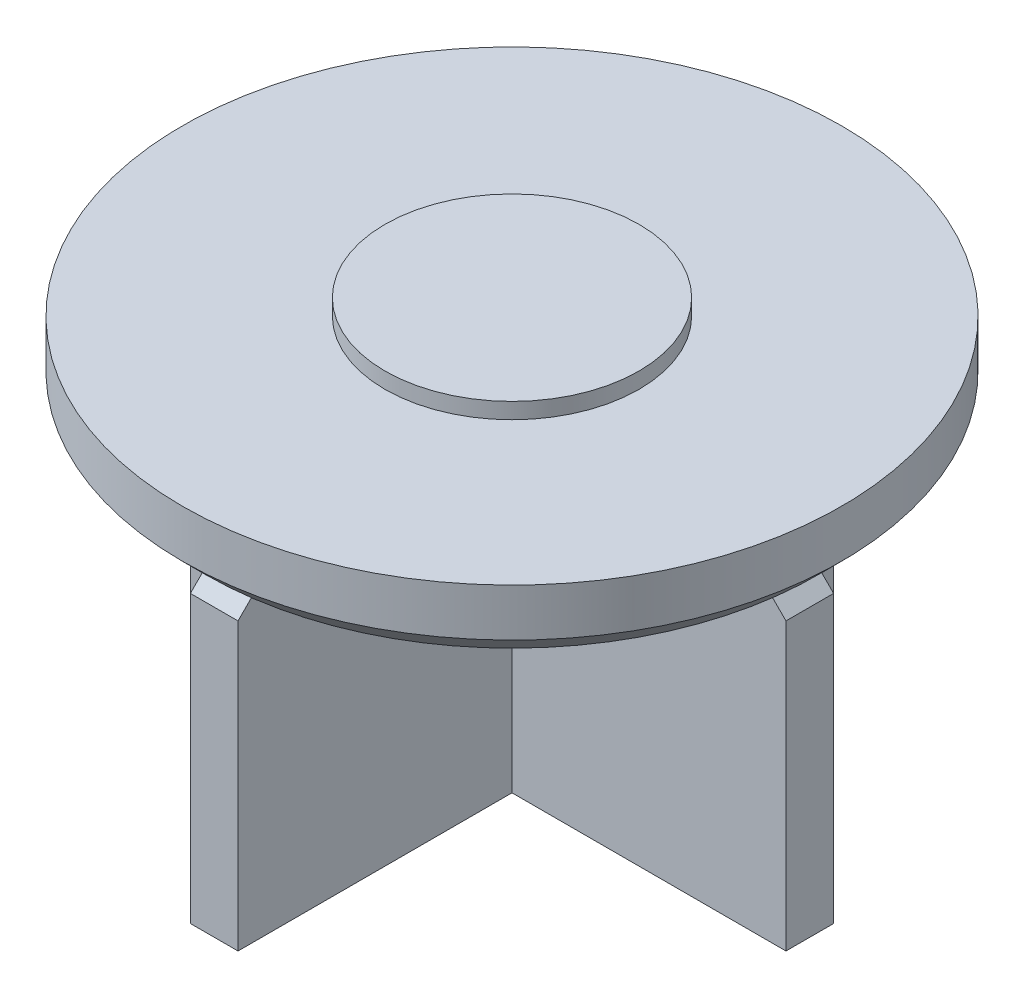
ISO-10303-21;
HEADER;
FILE_DESCRIPTION(('STEP AP214'),'2;1');
FILE_NAME('part.step','',(''),(''),'','','');
FILE_SCHEMA(('AUTOMOTIVE_DESIGN { 1 0 10303 214 1 1 1 1 }'));
ENDSEC;
DATA;
#1=APPLICATION_CONTEXT('core data for automotive mechanical design processes');
#2=APPLICATION_PROTOCOL_DEFINITION('international standard','automotive_design',2000,#1);
#3=PRODUCT_CONTEXT('',#1,'mechanical');
#4=PRODUCT('Part','Part','',(#3));
#5=PRODUCT_RELATED_PRODUCT_CATEGORY('part','',(#4));
#6=PRODUCT_DEFINITION_FORMATION('','',#4);
#7=PRODUCT_DEFINITION_CONTEXT('part definition',#1,'design');
#8=PRODUCT_DEFINITION('design','',#6,#7);
#9=PRODUCT_DEFINITION_SHAPE('','',#8);
#10=(LENGTH_UNIT() NAMED_UNIT(*) SI_UNIT(.MILLI.,.METRE.));
#11=(NAMED_UNIT(*) PLANE_ANGLE_UNIT() SI_UNIT($,.RADIAN.));
#12=(NAMED_UNIT(*) SI_UNIT($,.STERADIAN.) SOLID_ANGLE_UNIT());
#13=UNCERTAINTY_MEASURE_WITH_UNIT(LENGTH_MEASURE(1.E-05),#10,'distance_accuracy_value','');
#14=(GEOMETRIC_REPRESENTATION_CONTEXT(3) GLOBAL_UNCERTAINTY_ASSIGNED_CONTEXT((#13)) GLOBAL_UNIT_ASSIGNED_CONTEXT((#10,
#11,#12)) REPRESENTATION_CONTEXT('',''));
#15=CARTESIAN_POINT('',(0.,0.,0.));
#16=DIRECTION('',(0.,0.,1.));
#17=DIRECTION('',(1.,0.,0.));
#18=AXIS2_PLACEMENT_3D('',#15,#16,#17);
#19=CARTESIAN_POINT('',(3.00000000000002,40.,3.));
#20=DIRECTION('',(0.,0.,-1.));
#21=DIRECTION('',(-1.,0.,0.));
#22=AXIS2_PLACEMENT_3D('',#19,#20,#21);
#23=PLANE('',#22);
#24=DIRECTION('',(0.,-1.,0.));
#25=VECTOR('',#24,1.);
#26=CARTESIAN_POINT('',(37.5,40.,3.));
#27=LINE('',#26,#25);
#28=CARTESIAN_POINT('',(37.5,36.,3.));
#29=VERTEX_POINT('',#28);
#30=CARTESIAN_POINT('',(37.5,0.,3.));
#31=VERTEX_POINT('',#30);
#32=EDGE_CURVE('E287',#29,#31,#27,.T.);
#33=ORIENTED_EDGE('',*,*,#32,.F.);
#34=DIRECTION('',(0.707106781186546,-0.707106781186549,0.));
#35=VECTOR('',#34,1.);
#36=CARTESIAN_POINT('',(33.5,40.,3.));
#37=LINE('',#36,#35);
#38=CARTESIAN_POINT('',(33.5,40.,3.));
#39=VERTEX_POINT('',#38);
#40=EDGE_CURVE('E326',#29,#39,#37,.F.);
#41=ORIENTED_EDGE('',*,*,#40,.T.);
#42=DIRECTION('',(1.,0.,0.));
#43=VECTOR('',#42,1.);
#44=CARTESIAN_POINT('',(3.00000000000002,40.,3.));
#45=LINE('',#44,#43);
#46=CARTESIAN_POINT('',(3.00000000000002,40.,3.));
#47=VERTEX_POINT('',#46);
#48=EDGE_CURVE('E256',#47,#39,#45,.T.);
#49=ORIENTED_EDGE('',*,*,#48,.F.);
#50=DIRECTION('',(0.,-1.,0.));
#51=VECTOR('',#50,1.);
#52=CARTESIAN_POINT('',(3.00000000000002,40.,3.));
#53=LINE('',#52,#51);
#54=CARTESIAN_POINT('',(3.00000000000002,0.,3.));
#55=VERTEX_POINT('',#54);
#56=EDGE_CURVE('E212',#47,#55,#53,.T.);
#57=ORIENTED_EDGE('',*,*,#56,.T.);
#58=DIRECTION('',(1.,0.,0.));
#59=VECTOR('',#58,1.);
#60=CARTESIAN_POINT('',(3.00000000000002,0.,3.));
#61=LINE('',#60,#59);
#62=EDGE_CURVE('E213',#55,#31,#61,.T.);
#63=ORIENTED_EDGE('',*,*,#62,.T.);
#64=EDGE_LOOP('',(#33,#41,#49,#57,#63));
#65=FACE_BOUND('',#64,.T.);
#66=ADVANCED_FACE('F47',(#65),#23,.F.);
#67=CARTESIAN_POINT('',(37.5,40.,-3.));
#68=DIRECTION('',(-1.,0.,0.));
#69=DIRECTION('',(0.,0.,1.));
#70=AXIS2_PLACEMENT_3D('',#67,#68,#69);
#71=PLANE('',#70);
#72=DIRECTION('',(0.,-1.,0.));
#73=VECTOR('',#72,1.);
#74=CARTESIAN_POINT('',(37.5,40.,-3.));
#75=LINE('',#74,#73);
#76=CARTESIAN_POINT('',(37.5,36.,-3.));
#77=VERTEX_POINT('',#76);
#78=CARTESIAN_POINT('',(37.5,0.,-3.));
#79=VERTEX_POINT('',#78);
#80=EDGE_CURVE('E284',#77,#79,#75,.T.);
#81=ORIENTED_EDGE('',*,*,#80,.F.);
#82=DIRECTION('',(0.,0.,1.));
#83=VECTOR('',#82,1.);
#84=CARTESIAN_POINT('',(37.5,36.,-3.));
#85=LINE('',#84,#83);
#86=EDGE_CURVE('E323',#77,#29,#85,.T.);
#87=ORIENTED_EDGE('',*,*,#86,.T.);
#88=ORIENTED_EDGE('',*,*,#32,.T.);
#89=DIRECTION('',(0.,0.,-1.));
#90=VECTOR('',#89,1.);
#91=CARTESIAN_POINT('',(37.5,0.,-3.));
#92=LINE('',#91,#90);
#93=EDGE_CURVE('E217',#31,#79,#92,.T.);
#94=ORIENTED_EDGE('',*,*,#93,.T.);
#95=EDGE_LOOP('',(#81,#87,#88,#94));
#96=FACE_BOUND('',#95,.T.);
#97=ADVANCED_FACE('F405',(#96),#71,.F.);
#98=CARTESIAN_POINT('',(3.00000000000002,40.,-3.));
#99=DIRECTION('',(0.,0.,1.));
#100=DIRECTION('',(1.,0.,0.));
#101=AXIS2_PLACEMENT_3D('',#98,#99,#100);
#102=PLANE('',#101);
#103=DIRECTION('',(-1.,0.,0.));
#104=VECTOR('',#103,1.);
#105=CARTESIAN_POINT('',(3.00000000000002,40.,-3.));
#106=LINE('',#105,#104);
#107=CARTESIAN_POINT('',(33.5,40.,-3.));
#108=VERTEX_POINT('',#107);
#109=CARTESIAN_POINT('',(3.00000000000002,40.,-3.));
#110=VERTEX_POINT('',#109);
#111=EDGE_CURVE('E197',#108,#110,#106,.T.);
#112=ORIENTED_EDGE('',*,*,#111,.F.);
#113=DIRECTION('',(-0.707106781186546,0.707106781186549,0.));
#114=VECTOR('',#113,1.);
#115=CARTESIAN_POINT('',(33.5,40.,-3.));
#116=LINE('',#115,#114);
#117=EDGE_CURVE('E320',#108,#77,#116,.F.);
#118=ORIENTED_EDGE('',*,*,#117,.T.);
#119=ORIENTED_EDGE('',*,*,#80,.T.);
#120=DIRECTION('',(-1.,0.,0.));
#121=VECTOR('',#120,1.);
#122=CARTESIAN_POINT('',(3.00000000000002,0.,-3.));
#123=LINE('',#122,#121);
#124=CARTESIAN_POINT('',(3.00000000000002,0.,-3.));
#125=VERTEX_POINT('',#124);
#126=EDGE_CURVE('E222',#79,#125,#123,.T.);
#127=ORIENTED_EDGE('',*,*,#126,.T.);
#128=DIRECTION('',(0.,-1.,0.));
#129=VECTOR('',#128,1.);
#130=CARTESIAN_POINT('',(3.00000000000002,40.,-3.));
#131=LINE('',#130,#129);
#132=EDGE_CURVE('E280',#110,#125,#131,.T.);
#133=ORIENTED_EDGE('',*,*,#132,.F.);
#134=EDGE_LOOP('',(#112,#118,#119,#127,#133));
#135=FACE_BOUND('',#134,.T.);
#136=ADVANCED_FACE('F359',(#135),#102,.F.);
#137=CARTESIAN_POINT('',(3.00000000000001,40.,-37.5));
#138=DIRECTION('',(-1.,0.,0.));
#139=DIRECTION('',(0.,0.,1.));
#140=AXIS2_PLACEMENT_3D('',#137,#138,#139);
#141=PLANE('',#140);
#142=DIRECTION('',(0.,-1.,0.));
#143=VECTOR('',#142,1.);
#144=CARTESIAN_POINT('',(3.00000000000001,40.,-37.5));
#145=LINE('',#144,#143);
#146=CARTESIAN_POINT('',(3.00000000000001,36.,-37.5));
#147=VERTEX_POINT('',#146);
#148=CARTESIAN_POINT('',(3.00000000000001,0.,-37.5));
#149=VERTEX_POINT('',#148);
#150=EDGE_CURVE('E277',#147,#149,#145,.T.);
#151=ORIENTED_EDGE('',*,*,#150,.F.);
#152=DIRECTION('',(0.,-0.707106781186549,-0.707106781186546));
#153=VECTOR('',#152,1.);
#154=CARTESIAN_POINT('',(3.00000000000001,40.,-33.5));
#155=LINE('',#154,#153);
#156=CARTESIAN_POINT('',(3.00000000000001,40.,-33.5));
#157=VERTEX_POINT('',#156);
#158=EDGE_CURVE('E317',#147,#157,#155,.F.);
#159=ORIENTED_EDGE('',*,*,#158,.T.);
#160=DIRECTION('',(0.,0.,-1.));
#161=VECTOR('',#160,1.);
#162=CARTESIAN_POINT('',(3.00000000000001,40.,-37.5));
#163=LINE('',#162,#161);
#164=EDGE_CURVE('E194',#110,#157,#163,.T.);
#165=ORIENTED_EDGE('',*,*,#164,.F.);
#166=ORIENTED_EDGE('',*,*,#132,.T.);
#167=DIRECTION('',(0.,0.,-1.));
#168=VECTOR('',#167,1.);
#169=CARTESIAN_POINT('',(3.00000000000001,0.,-37.5));
#170=LINE('',#169,#168);
#171=EDGE_CURVE('E225',#125,#149,#170,.T.);
#172=ORIENTED_EDGE('',*,*,#171,.T.);
#173=EDGE_LOOP('',(#151,#159,#165,#166,#172));
#174=FACE_BOUND('',#173,.T.);
#175=ADVANCED_FACE('F365',(#174),#141,.F.);
#176=CARTESIAN_POINT('',(-2.99999999999999,40.,-37.5));
#177=DIRECTION('',(0.,0.,1.));
#178=DIRECTION('',(1.,0.,0.));
#179=AXIS2_PLACEMENT_3D('',#176,#177,#178);
#180=PLANE('',#179);
#181=DIRECTION('',(0.,-1.,0.));
#182=VECTOR('',#181,1.);
#183=CARTESIAN_POINT('',(-2.99999999999999,40.,-37.5));
#184=LINE('',#183,#182);
#185=CARTESIAN_POINT('',(-2.99999999999999,36.,-37.5));
#186=VERTEX_POINT('',#185);
#187=CARTESIAN_POINT('',(-2.99999999999999,0.,-37.5));
#188=VERTEX_POINT('',#187);
#189=EDGE_CURVE('E186',#186,#188,#184,.T.);
#190=ORIENTED_EDGE('',*,*,#189,.F.);
#191=DIRECTION('',(1.,0.,0.));
#192=VECTOR('',#191,1.);
#193=CARTESIAN_POINT('',(-2.99999999999999,36.,-37.5));
#194=LINE('',#193,#192);
#195=EDGE_CURVE('E314',#186,#147,#194,.T.);
#196=ORIENTED_EDGE('',*,*,#195,.T.);
#197=ORIENTED_EDGE('',*,*,#150,.T.);
#198=DIRECTION('',(-1.,0.,0.));
#199=VECTOR('',#198,1.);
#200=CARTESIAN_POINT('',(-2.99999999999999,0.,-37.5));
#201=LINE('',#200,#199);
#202=EDGE_CURVE('E229',#149,#188,#201,.T.);
#203=ORIENTED_EDGE('',*,*,#202,.T.);
#204=EDGE_LOOP('',(#190,#196,#197,#203));
#205=FACE_BOUND('',#204,.T.);
#206=ADVANCED_FACE('F372',(#205),#180,.F.);
#207=CARTESIAN_POINT('',(-2.99999999999999,40.,-37.5));
#208=DIRECTION('',(1.,0.,0.));
#209=DIRECTION('',(0.,0.,-1.));
#210=AXIS2_PLACEMENT_3D('',#207,#208,#209);
#211=PLANE('',#210);
#212=DIRECTION('',(0.,0.,1.));
#213=VECTOR('',#212,1.);
#214=CARTESIAN_POINT('',(-2.99999999999999,40.,-37.5));
#215=LINE('',#214,#213);
#216=CARTESIAN_POINT('',(-2.99999999999999,40.,-33.5));
#217=VERTEX_POINT('',#216);
#218=CARTESIAN_POINT('',(-2.99999999999999,40.,-3.00000000000001));
#219=VERTEX_POINT('',#218);
#220=EDGE_CURVE('E177',#217,#219,#215,.T.);
#221=ORIENTED_EDGE('',*,*,#220,.F.);
#222=DIRECTION('',(0.,0.707106781186549,0.707106781186546));
#223=VECTOR('',#222,1.);
#224=CARTESIAN_POINT('',(-2.99999999999999,40.,-33.5));
#225=LINE('',#224,#223);
#226=EDGE_CURVE('E311',#217,#186,#225,.F.);
#227=ORIENTED_EDGE('',*,*,#226,.T.);
#228=ORIENTED_EDGE('',*,*,#189,.T.);
#229=DIRECTION('',(0.,0.,1.));
#230=VECTOR('',#229,1.);
#231=CARTESIAN_POINT('',(-2.99999999999999,0.,-37.5));
#232=LINE('',#231,#230);
#233=CARTESIAN_POINT('',(-2.99999999999999,0.,-3.00000000000001));
#234=VERTEX_POINT('',#233);
#235=EDGE_CURVE('E184',#188,#234,#232,.T.);
#236=ORIENTED_EDGE('',*,*,#235,.T.);
#237=DIRECTION('',(0.,-1.,0.));
#238=VECTOR('',#237,1.);
#239=CARTESIAN_POINT('',(-2.99999999999999,40.,-3.00000000000001));
#240=LINE('',#239,#238);
#241=EDGE_CURVE('E167',#219,#234,#240,.T.);
#242=ORIENTED_EDGE('',*,*,#241,.F.);
#243=EDGE_LOOP('',(#221,#227,#228,#236,#242));
#244=FACE_BOUND('',#243,.T.);
#245=ADVANCED_FACE('F181',(#244),#211,.F.);
#246=CARTESIAN_POINT('',(-37.5,40.,-3.));
#247=DIRECTION('',(0.,0.,1.));
#248=DIRECTION('',(1.,0.,0.));
#249=AXIS2_PLACEMENT_3D('',#246,#247,#248);
#250=PLANE('',#249);
#251=DIRECTION('',(0.,-1.,0.));
#252=VECTOR('',#251,1.);
#253=CARTESIAN_POINT('',(-37.5,40.,-3.));
#254=LINE('',#253,#252);
#255=CARTESIAN_POINT('',(-37.5,36.,-3.));
#256=VERTEX_POINT('',#255);
#257=CARTESIAN_POINT('',(-37.5,0.,-3.));
#258=VERTEX_POINT('',#257);
#259=EDGE_CURVE('E187',#256,#258,#254,.T.);
#260=ORIENTED_EDGE('',*,*,#259,.F.);
#261=DIRECTION('',(-0.707106781186546,-0.707106781186549,0.));
#262=VECTOR('',#261,1.);
#263=CARTESIAN_POINT('',(-33.5,40.,-3.));
#264=LINE('',#263,#262);
#265=CARTESIAN_POINT('',(-33.5,40.,-3.));
#266=VERTEX_POINT('',#265);
#267=EDGE_CURVE('E170',#256,#266,#264,.F.);
#268=ORIENTED_EDGE('',*,*,#267,.T.);
#269=DIRECTION('',(-1.,0.,0.));
#270=VECTOR('',#269,1.);
#271=CARTESIAN_POINT('',(-37.5,40.,-3.));
#272=LINE('',#271,#270);
#273=EDGE_CURVE('E162',#219,#266,#272,.T.);
#274=ORIENTED_EDGE('',*,*,#273,.F.);
#275=ORIENTED_EDGE('',*,*,#241,.T.);
#276=DIRECTION('',(-1.,0.,0.));
#277=VECTOR('',#276,1.);
#278=CARTESIAN_POINT('',(-37.5,0.,-3.));
#279=LINE('',#278,#277);
#280=EDGE_CURVE('E235',#234,#258,#279,.T.);
#281=ORIENTED_EDGE('',*,*,#280,.T.);
#282=EDGE_LOOP('',(#260,#268,#274,#275,#281));
#283=FACE_BOUND('',#282,.T.);
#284=ADVANCED_FACE('F165',(#283),#250,.F.);
#285=CARTESIAN_POINT('',(-37.5,40.,-3.));
#286=DIRECTION('',(1.,0.,0.));
#287=DIRECTION('',(0.,0.,-1.));
#288=AXIS2_PLACEMENT_3D('',#285,#286,#287);
#289=PLANE('',#288);
#290=DIRECTION('',(0.,-1.,0.));
#291=VECTOR('',#290,1.);
#292=CARTESIAN_POINT('',(-37.5,40.,3.));
#293=LINE('',#292,#291);
#294=CARTESIAN_POINT('',(-37.5,36.,3.));
#295=VERTEX_POINT('',#294);
#296=CARTESIAN_POINT('',(-37.5,0.,3.));
#297=VERTEX_POINT('',#296);
#298=EDGE_CURVE('E270',#295,#297,#293,.T.);
#299=ORIENTED_EDGE('',*,*,#298,.F.);
#300=DIRECTION('',(0.,0.,-1.));
#301=VECTOR('',#300,1.);
#302=CARTESIAN_POINT('',(-37.5,36.,-3.));
#303=LINE('',#302,#301);
#304=EDGE_CURVE('E306',#295,#256,#303,.T.);
#305=ORIENTED_EDGE('',*,*,#304,.T.);
#306=ORIENTED_EDGE('',*,*,#259,.T.);
#307=DIRECTION('',(0.,0.,1.));
#308=VECTOR('',#307,1.);
#309=CARTESIAN_POINT('',(-37.5,0.,-3.));
#310=LINE('',#309,#308);
#311=EDGE_CURVE('E238',#258,#297,#310,.T.);
#312=ORIENTED_EDGE('',*,*,#311,.T.);
#313=EDGE_LOOP('',(#299,#305,#306,#312));
#314=FACE_BOUND('',#313,.T.);
#315=ADVANCED_FACE('F484',(#314),#289,.F.);
#316=CARTESIAN_POINT('',(-37.5,40.,3.));
#317=DIRECTION('',(0.,0.,-1.));
#318=DIRECTION('',(-1.,0.,0.));
#319=AXIS2_PLACEMENT_3D('',#316,#317,#318);
#320=PLANE('',#319);
#321=DIRECTION('',(1.,0.,0.));
#322=VECTOR('',#321,1.);
#323=CARTESIAN_POINT('',(-37.5,40.,3.));
#324=LINE('',#323,#322);
#325=CARTESIAN_POINT('',(-33.5,40.,3.));
#326=VERTEX_POINT('',#325);
#327=CARTESIAN_POINT('',(-2.99999999999999,40.,3.));
#328=VERTEX_POINT('',#327);
#329=EDGE_CURVE('E176',#326,#328,#324,.T.);
#330=ORIENTED_EDGE('',*,*,#329,.F.);
#331=DIRECTION('',(0.707106781186546,0.707106781186549,0.));
#332=VECTOR('',#331,1.);
#333=CARTESIAN_POINT('',(-33.5,40.,3.));
#334=LINE('',#333,#332);
#335=EDGE_CURVE('E303',#326,#295,#334,.F.);
#336=ORIENTED_EDGE('',*,*,#335,.T.);
#337=ORIENTED_EDGE('',*,*,#298,.T.);
#338=DIRECTION('',(1.,0.,0.));
#339=VECTOR('',#338,1.);
#340=CARTESIAN_POINT('',(-37.5,0.,3.));
#341=LINE('',#340,#339);
#342=CARTESIAN_POINT('',(-2.99999999999999,0.,3.));
#343=VERTEX_POINT('',#342);
#344=EDGE_CURVE('E242',#297,#343,#341,.T.);
#345=ORIENTED_EDGE('',*,*,#344,.T.);
#346=DIRECTION('',(0.,-1.,0.));
#347=VECTOR('',#346,1.);
#348=CARTESIAN_POINT('',(-2.99999999999999,40.,3.));
#349=LINE('',#348,#347);
#350=EDGE_CURVE('E266',#328,#343,#349,.T.);
#351=ORIENTED_EDGE('',*,*,#350,.F.);
#352=EDGE_LOOP('',(#330,#336,#337,#345,#351));
#353=FACE_BOUND('',#352,.T.);
#354=ADVANCED_FACE('F386',(#353),#320,.F.);
#355=CARTESIAN_POINT('',(-2.99999999999999,40.,3.));
#356=DIRECTION('',(1.,0.,0.));
#357=DIRECTION('',(0.,0.,-1.));
#358=AXIS2_PLACEMENT_3D('',#355,#356,#357);
#359=PLANE('',#358);
#360=DIRECTION('',(0.,-1.,0.));
#361=VECTOR('',#360,1.);
#362=CARTESIAN_POINT('',(-2.99999999999998,40.,37.5));
#363=LINE('',#362,#361);
#364=CARTESIAN_POINT('',(-2.99999999999998,36.,37.5));
#365=VERTEX_POINT('',#364);
#366=CARTESIAN_POINT('',(-2.99999999999998,0.,37.5));
#367=VERTEX_POINT('',#366);
#368=EDGE_CURVE('E263',#365,#367,#363,.T.);
#369=ORIENTED_EDGE('',*,*,#368,.F.);
#370=DIRECTION('',(0.,-0.707106781186549,0.707106781186546));
#371=VECTOR('',#370,1.);
#372=CARTESIAN_POINT('',(-2.99999999999998,40.,33.5));
#373=LINE('',#372,#371);
#374=CARTESIAN_POINT('',(-2.99999999999998,40.,33.5));
#375=VERTEX_POINT('',#374);
#376=EDGE_CURVE('E333',#365,#375,#373,.F.);
#377=ORIENTED_EDGE('',*,*,#376,.T.);
#378=DIRECTION('',(0.,0.,1.));
#379=VECTOR('',#378,1.);
#380=CARTESIAN_POINT('',(-2.99999999999999,40.,3.));
#381=LINE('',#380,#379);
#382=EDGE_CURVE('E204',#328,#375,#381,.T.);
#383=ORIENTED_EDGE('',*,*,#382,.F.);
#384=ORIENTED_EDGE('',*,*,#350,.T.);
#385=DIRECTION('',(0.,0.,1.));
#386=VECTOR('',#385,1.);
#387=CARTESIAN_POINT('',(-2.99999999999999,0.,3.));
#388=LINE('',#387,#386);
#389=EDGE_CURVE('E245',#343,#367,#388,.T.);
#390=ORIENTED_EDGE('',*,*,#389,.T.);
#391=EDGE_LOOP('',(#369,#377,#383,#384,#390));
#392=FACE_BOUND('',#391,.T.);
#393=ADVANCED_FACE('F390',(#392),#359,.F.);
#394=CARTESIAN_POINT('',(-2.99999999999998,40.,37.5));
#395=DIRECTION('',(0.,0.,-1.));
#396=DIRECTION('',(-1.,0.,0.));
#397=AXIS2_PLACEMENT_3D('',#394,#395,#396);
#398=PLANE('',#397);
#399=DIRECTION('',(0.,-1.,0.));
#400=VECTOR('',#399,1.);
#401=CARTESIAN_POINT('',(3.00000000000002,40.,37.5));
#402=LINE('',#401,#400);
#403=CARTESIAN_POINT('',(3.00000000000002,36.,37.5));
#404=VERTEX_POINT('',#403);
#405=CARTESIAN_POINT('',(3.00000000000002,0.,37.5));
#406=VERTEX_POINT('',#405);
#407=EDGE_CURVE('E260',#404,#406,#402,.T.);
#408=ORIENTED_EDGE('',*,*,#407,.F.);
#409=DIRECTION('',(-1.,0.,0.));
#410=VECTOR('',#409,1.);
#411=CARTESIAN_POINT('',(-2.99999999999998,36.,37.5));
#412=LINE('',#411,#410);
#413=EDGE_CURVE('E64',#404,#365,#412,.T.);
#414=ORIENTED_EDGE('',*,*,#413,.T.);
#415=ORIENTED_EDGE('',*,*,#368,.T.);
#416=DIRECTION('',(1.,0.,0.));
#417=VECTOR('',#416,1.);
#418=CARTESIAN_POINT('',(-2.99999999999998,0.,37.5));
#419=LINE('',#418,#417);
#420=EDGE_CURVE('E249',#367,#406,#419,.T.);
#421=ORIENTED_EDGE('',*,*,#420,.T.);
#422=EDGE_LOOP('',(#408,#414,#415,#421));
#423=FACE_BOUND('',#422,.T.);
#424=ADVANCED_FACE('F408',(#423),#398,.F.);
#425=CARTESIAN_POINT('',(3.00000000000002,40.,3.));
#426=DIRECTION('',(-1.,0.,0.));
#427=DIRECTION('',(0.,0.,1.));
#428=AXIS2_PLACEMENT_3D('',#425,#426,#427);
#429=PLANE('',#428);
#430=DIRECTION('',(0.,0.,-1.));
#431=VECTOR('',#430,1.);
#432=CARTESIAN_POINT('',(3.00000000000002,40.,3.));
#433=LINE('',#432,#431);
#434=CARTESIAN_POINT('',(3.00000000000002,40.,33.5));
#435=VERTEX_POINT('',#434);
#436=EDGE_CURVE('E208',#435,#47,#433,.T.);
#437=ORIENTED_EDGE('',*,*,#436,.F.);
#438=DIRECTION('',(0.,0.707106781186549,-0.707106781186546));
#439=VECTOR('',#438,1.);
#440=CARTESIAN_POINT('',(3.00000000000002,40.,33.5));
#441=LINE('',#440,#439);
#442=EDGE_CURVE('E72',#435,#404,#441,.F.);
#443=ORIENTED_EDGE('',*,*,#442,.T.);
#444=ORIENTED_EDGE('',*,*,#407,.T.);
#445=DIRECTION('',(0.,0.,-1.));
#446=VECTOR('',#445,1.);
#447=CARTESIAN_POINT('',(3.00000000000002,0.,3.));
#448=LINE('',#447,#446);
#449=EDGE_CURVE('E253',#406,#55,#448,.T.);
#450=ORIENTED_EDGE('',*,*,#449,.T.);
#451=ORIENTED_EDGE('',*,*,#56,.F.);
#452=EDGE_LOOP('',(#437,#443,#444,#450,#451));
#453=FACE_BOUND('',#452,.T.);
#454=ADVANCED_FACE('F396',(#453),#429,.F.);
#455=CARTESIAN_POINT('',(0.,0.,0.));
#456=DIRECTION('',(0.,-1.,0.));
#457=DIRECTION('',(0.,0.,-1.));
#458=AXIS2_PLACEMENT_3D('',#455,#456,#457);
#459=PLANE('',#458);
#460=ORIENTED_EDGE('',*,*,#62,.F.);
#461=ORIENTED_EDGE('',*,*,#449,.F.);
#462=ORIENTED_EDGE('',*,*,#420,.F.);
#463=ORIENTED_EDGE('',*,*,#389,.F.);
#464=ORIENTED_EDGE('',*,*,#344,.F.);
#465=ORIENTED_EDGE('',*,*,#311,.F.);
#466=ORIENTED_EDGE('',*,*,#280,.F.);
#467=ORIENTED_EDGE('',*,*,#235,.F.);
#468=ORIENTED_EDGE('',*,*,#202,.F.);
#469=ORIENTED_EDGE('',*,*,#171,.F.);
#470=ORIENTED_EDGE('',*,*,#126,.F.);
#471=ORIENTED_EDGE('',*,*,#93,.F.);
#472=EDGE_LOOP('',(#460,#461,#462,#463,#464,#465,#466,#467,#468,#469,#470,#471));
#473=FACE_BOUND('',#472,.T.);
#474=ADVANCED_FACE('F376',(#473),#459,.T.);
#475=CARTESIAN_POINT('',(-33.5,40.,0.));
#476=DIRECTION('',(0.707106781186549,-0.707106781186546,0.));
#477=DIRECTION('',(0.,0.,1.));
#478=AXIS2_PLACEMENT_3D('',#475,#476,#477);
#479=PLANE('',#478);
#480=ORIENTED_EDGE('',*,*,#267,.F.);
#481=ORIENTED_EDGE('',*,*,#304,.F.);
#482=ORIENTED_EDGE('',*,*,#335,.F.);
#483=DIRECTION('',(0.,0.,1.));
#484=VECTOR('',#483,1.);
#485=CARTESIAN_POINT('',(-33.5,40.,0.));
#486=LINE('',#485,#484);
#487=EDGE_CURVE('E300',#266,#326,#486,.T.);
#488=ORIENTED_EDGE('',*,*,#487,.F.);
#489=EDGE_LOOP('',(#480,#481,#482,#488));
#490=FACE_BOUND('',#489,.T.);
#491=ADVANCED_FACE('F382',(#490),#479,.F.);
#492=CARTESIAN_POINT('',(0.,40.,-33.5));
#493=DIRECTION('',(0.,-0.707106781186546,0.707106781186549));
#494=DIRECTION('',(-1.,0.,0.));
#495=AXIS2_PLACEMENT_3D('',#492,#493,#494);
#496=PLANE('',#495);
#497=ORIENTED_EDGE('',*,*,#158,.F.);
#498=ORIENTED_EDGE('',*,*,#195,.F.);
#499=ORIENTED_EDGE('',*,*,#226,.F.);
#500=DIRECTION('',(-1.,0.,0.));
#501=VECTOR('',#500,1.);
#502=CARTESIAN_POINT('',(0.,40.,-33.5));
#503=LINE('',#502,#501);
#504=EDGE_CURVE('E192',#157,#217,#503,.T.);
#505=ORIENTED_EDGE('',*,*,#504,.F.);
#506=EDGE_LOOP('',(#497,#498,#499,#505));
#507=FACE_BOUND('',#506,.T.);
#508=ADVANCED_FACE('F369',(#507),#496,.F.);
#509=CARTESIAN_POINT('',(33.5,40.,0.));
#510=DIRECTION('',(-0.707106781186549,-0.707106781186546,0.));
#511=DIRECTION('',(0.,0.,-1.));
#512=AXIS2_PLACEMENT_3D('',#509,#510,#511);
#513=PLANE('',#512);
#514=ORIENTED_EDGE('',*,*,#40,.F.);
#515=ORIENTED_EDGE('',*,*,#86,.F.);
#516=ORIENTED_EDGE('',*,*,#117,.F.);
#517=DIRECTION('',(0.,0.,-1.));
#518=VECTOR('',#517,1.);
#519=CARTESIAN_POINT('',(33.5,40.,0.));
#520=LINE('',#519,#518);
#521=EDGE_CURVE('E294',#39,#108,#520,.T.);
#522=ORIENTED_EDGE('',*,*,#521,.F.);
#523=EDGE_LOOP('',(#514,#515,#516,#522));
#524=FACE_BOUND('',#523,.T.);
#525=ADVANCED_FACE('F403',(#524),#513,.F.);
#526=CARTESIAN_POINT('',(0.,40.,33.5));
#527=DIRECTION('',(0.,-0.707106781186546,-0.707106781186549));
#528=DIRECTION('',(1.,0.,0.));
#529=AXIS2_PLACEMENT_3D('',#526,#527,#528);
#530=PLANE('',#529);
#531=ORIENTED_EDGE('',*,*,#376,.F.);
#532=ORIENTED_EDGE('',*,*,#413,.F.);
#533=ORIENTED_EDGE('',*,*,#442,.F.);
#534=DIRECTION('',(1.,0.,0.));
#535=VECTOR('',#534,1.);
#536=CARTESIAN_POINT('',(0.,40.,33.5));
#537=LINE('',#536,#535);
#538=EDGE_CURVE('E290',#375,#435,#537,.T.);
#539=ORIENTED_EDGE('',*,*,#538,.F.);
#540=EDGE_LOOP('',(#531,#532,#533,#539));
#541=FACE_BOUND('',#540,.T.);
#542=ADVANCED_FACE('F394',(#541),#530,.F.);
#543=CARTESIAN_POINT('',(0.,40.,0.));
#544=DIRECTION('',(0.,1.,0.));
#545=DIRECTION('',(0.,0.,1.));
#546=AXIS2_PLACEMENT_3D('',#543,#544,#545);
#547=PLANE('',#546);
#548=CARTESIAN_POINT('',(0.,40.,0.));
#549=DIRECTION('',(0.,1.,0.));
#550=DIRECTION('',(0.,0.,1.));
#551=AXIS2_PLACEMENT_3D('',#548,#549,#550);
#552=CIRCLE('',#551,38.5);
#553=CARTESIAN_POINT('',(0.,40.,38.5));
#554=VERTEX_POINT('',#553);
#555=EDGE_CURVE('E11',#554,#554,#552,.F.);
#556=ORIENTED_EDGE('',*,*,#555,.T.);
#557=EDGE_LOOP('',(#556));
#558=FACE_BOUND('',#557,.T.);
#559=ORIENTED_EDGE('',*,*,#220,.T.);
#560=ORIENTED_EDGE('',*,*,#273,.T.);
#561=ORIENTED_EDGE('',*,*,#487,.T.);
#562=ORIENTED_EDGE('',*,*,#329,.T.);
#563=ORIENTED_EDGE('',*,*,#382,.T.);
#564=ORIENTED_EDGE('',*,*,#538,.T.);
#565=ORIENTED_EDGE('',*,*,#436,.T.);
#566=ORIENTED_EDGE('',*,*,#48,.T.);
#567=ORIENTED_EDGE('',*,*,#521,.T.);
#568=ORIENTED_EDGE('',*,*,#111,.T.);
#569=ORIENTED_EDGE('',*,*,#164,.T.);
#570=ORIENTED_EDGE('',*,*,#504,.T.);
#571=EDGE_LOOP('',(#559,#560,#561,#562,#563,#564,#565,#566,#567,#568,#569,#570));
#572=FACE_BOUND('',#571,.T.);
#573=ADVANCED_FACE('F189',(#558,#572),#547,.F.);
#574=CARTESIAN_POINT('',(0.,49.,0.));
#575=DIRECTION('',(0.,-1.,0.));
#576=DIRECTION('',(0.,0.,-1.));
#577=AXIS2_PLACEMENT_3D('',#574,#575,#576);
#578=CYLINDRICAL_SURFACE('',#577,41.5);
#579=CARTESIAN_POINT('',(0.,43.,0.));
#580=DIRECTION('',(0.,1.,0.));
#581=DIRECTION('',(0.,0.,1.));
#582=AXIS2_PLACEMENT_3D('',#579,#580,#581);
#583=CIRCLE('',#582,41.5);
#584=CARTESIAN_POINT('',(0.,43.,41.5));
#585=VERTEX_POINT('',#584);
#586=EDGE_CURVE('E57',#585,#585,#583,.T.);
#587=ORIENTED_EDGE('',*,*,#586,.T.);
#588=EDGE_LOOP('',(#587));
#589=FACE_BOUND('',#588,.T.);
#590=CARTESIAN_POINT('',(0.,49.,0.));
#591=DIRECTION('',(0.,1.,0.));
#592=DIRECTION('',(0.,0.,1.));
#593=AXIS2_PLACEMENT_3D('',#590,#591,#592);
#594=CIRCLE('',#593,41.5);
#595=CARTESIAN_POINT('',(0.,49.,41.5));
#596=VERTEX_POINT('',#595);
#597=EDGE_CURVE('E218',#596,#596,#594,.T.);
#598=ORIENTED_EDGE('',*,*,#597,.F.);
#599=EDGE_LOOP('',(#598));
#600=FACE_BOUND('',#599,.T.);
#601=ADVANCED_FACE('F449',(#589,#600),#578,.T.);
#602=CARTESIAN_POINT('',(0.,49.,0.));
#603=DIRECTION('',(0.,1.,0.));
#604=DIRECTION('',(0.,0.,1.));
#605=AXIS2_PLACEMENT_3D('',#602,#603,#604);
#606=PLANE('',#605);
#607=CARTESIAN_POINT('',(0.,49.,0.));
#608=DIRECTION('',(0.,1.,0.));
#609=DIRECTION('',(0.,0.,1.));
#610=AXIS2_PLACEMENT_3D('',#607,#608,#609);
#611=CIRCLE('',#610,16.);
#612=CARTESIAN_POINT('',(0.,49.,16.));
#613=VERTEX_POINT('',#612);
#614=EDGE_CURVE('E335',#613,#613,#611,.T.);
#615=ORIENTED_EDGE('',*,*,#614,.F.);
#616=EDGE_LOOP('',(#615));
#617=FACE_BOUND('',#616,.T.);
#618=ORIENTED_EDGE('',*,*,#597,.T.);
#619=EDGE_LOOP('',(#618));
#620=FACE_BOUND('',#619,.T.);
#621=ADVANCED_FACE('F456',(#617,#620),#606,.T.);
#622=CARTESIAN_POINT('',(0.,51.,0.));
#623=DIRECTION('',(0.,-1.,0.));
#624=DIRECTION('',(0.,0.,-1.));
#625=AXIS2_PLACEMENT_3D('',#622,#623,#624);
#626=CYLINDRICAL_SURFACE('',#625,16.);
#627=CARTESIAN_POINT('',(0.,51.,0.));
#628=DIRECTION('',(0.,1.,0.));
#629=DIRECTION('',(0.,0.,1.));
#630=AXIS2_PLACEMENT_3D('',#627,#628,#629);
#631=CIRCLE('',#630,16.);
#632=CARTESIAN_POINT('',(0.,51.,16.));
#633=VERTEX_POINT('',#632);
#634=EDGE_CURVE('E347',#633,#633,#631,.T.);
#635=ORIENTED_EDGE('',*,*,#634,.F.);
#636=EDGE_LOOP('',(#635));
#637=FACE_BOUND('',#636,.T.);
#638=ORIENTED_EDGE('',*,*,#614,.T.);
#639=EDGE_LOOP('',(#638));
#640=FACE_BOUND('',#639,.T.);
#641=ADVANCED_FACE('F555',(#637,#640),#626,.T.);
#642=CARTESIAN_POINT('',(0.,51.,0.));
#643=DIRECTION('',(0.,1.,0.));
#644=DIRECTION('',(0.,0.,1.));
#645=AXIS2_PLACEMENT_3D('',#642,#643,#644);
#646=PLANE('',#645);
#647=ORIENTED_EDGE('',*,*,#634,.T.);
#648=EDGE_LOOP('',(#647));
#649=FACE_BOUND('',#648,.T.);
#650=ADVANCED_FACE('F564',(#649),#646,.T.);
#651=CARTESIAN_POINT('',(0.,43.,0.));
#652=DIRECTION('',(0.,1.,0.));
#653=DIRECTION('',(0.,0.,1.));
#654=AXIS2_PLACEMENT_3D('',#651,#652,#653);
#655=CONICAL_SURFACE('',#654,41.5,0.785398163397451);
#656=CARTESIAN_POINT('',(0.,40.,38.5));
#657=CARTESIAN_POINT('',(0.,40.03125,38.53125));
#658=CARTESIAN_POINT('',(0.,40.0625,38.5625));
#659=CARTESIAN_POINT('',(0.,40.125,38.625));
#660=CARTESIAN_POINT('',(0.,40.15625,38.65625));
#661=CARTESIAN_POINT('',(0.,40.21875,38.71875));
#662=CARTESIAN_POINT('',(0.,40.25,38.75));
#663=CARTESIAN_POINT('',(0.,40.3125,38.8125));
#664=CARTESIAN_POINT('',(0.,40.34375,38.84375));
#665=CARTESIAN_POINT('',(0.,40.40625,38.90625));
#666=CARTESIAN_POINT('',(0.,40.4375,38.9375));
#667=CARTESIAN_POINT('',(0.,40.5,39.));
#668=CARTESIAN_POINT('',(0.,40.53125,39.03125));
#669=CARTESIAN_POINT('',(0.,40.59375,39.09375));
#670=CARTESIAN_POINT('',(0.,40.625,39.125));
#671=CARTESIAN_POINT('',(0.,40.6875,39.1875));
#672=CARTESIAN_POINT('',(0.,40.71875,39.21875));
#673=CARTESIAN_POINT('',(0.,40.78125,39.28125));
#674=CARTESIAN_POINT('',(0.,40.8125,39.3125));
#675=CARTESIAN_POINT('',(0.,40.875,39.375));
#676=CARTESIAN_POINT('',(0.,40.90625,39.40625));
#677=CARTESIAN_POINT('',(0.,40.96875,39.46875));
#678=CARTESIAN_POINT('',(0.,41.,39.5));
#679=CARTESIAN_POINT('',(0.,41.0625,39.5625));
#680=CARTESIAN_POINT('',(0.,41.09375,39.59375));
#681=CARTESIAN_POINT('',(0.,41.15625,39.65625));
#682=CARTESIAN_POINT('',(0.,41.1875,39.6875));
#683=CARTESIAN_POINT('',(0.,41.25,39.75));
#684=CARTESIAN_POINT('',(0.,41.28125,39.78125));
#685=CARTESIAN_POINT('',(0.,41.34375,39.84375));
#686=CARTESIAN_POINT('',(0.,41.375,39.875));
#687=CARTESIAN_POINT('',(0.,41.4375,39.9375));
#688=CARTESIAN_POINT('',(0.,41.46875,39.96875));
#689=CARTESIAN_POINT('',(0.,41.53125,40.03125));
#690=CARTESIAN_POINT('',(0.,41.5625,40.0625));
#691=CARTESIAN_POINT('',(0.,41.625,40.125));
#692=CARTESIAN_POINT('',(0.,41.65625,40.15625));
#693=CARTESIAN_POINT('',(0.,41.71875,40.21875));
#694=CARTESIAN_POINT('',(0.,41.75,40.25));
#695=CARTESIAN_POINT('',(0.,41.8125,40.3125));
#696=CARTESIAN_POINT('',(0.,41.84375,40.34375));
#697=CARTESIAN_POINT('',(0.,41.90625,40.40625));
#698=CARTESIAN_POINT('',(0.,41.9375,40.4375));
#699=CARTESIAN_POINT('',(0.,42.,40.5));
#700=CARTESIAN_POINT('',(0.,42.03125,40.53125));
#701=CARTESIAN_POINT('',(0.,42.09375,40.59375));
#702=CARTESIAN_POINT('',(0.,42.125,40.625));
#703=CARTESIAN_POINT('',(0.,42.1875,40.6875));
#704=CARTESIAN_POINT('',(0.,42.21875,40.71875));
#705=CARTESIAN_POINT('',(0.,42.28125,40.78125));
#706=CARTESIAN_POINT('',(0.,42.3125,40.8125));
#707=CARTESIAN_POINT('',(0.,42.375,40.875));
#708=CARTESIAN_POINT('',(0.,42.40625,40.90625));
#709=CARTESIAN_POINT('',(0.,42.46875,40.96875));
#710=CARTESIAN_POINT('',(0.,42.5,41.));
#711=CARTESIAN_POINT('',(0.,42.5625,41.0625));
#712=CARTESIAN_POINT('',(0.,42.59375,41.09375));
#713=CARTESIAN_POINT('',(0.,42.65625,41.15625));
#714=CARTESIAN_POINT('',(0.,42.6875,41.1875));
#715=CARTESIAN_POINT('',(0.,42.75,41.25));
#716=CARTESIAN_POINT('',(0.,42.78125,41.28125));
#717=CARTESIAN_POINT('',(0.,42.84375,41.34375));
#718=CARTESIAN_POINT('',(0.,42.875,41.375));
#719=CARTESIAN_POINT('',(0.,42.9375,41.4375));
#720=CARTESIAN_POINT('',(0.,42.96875,41.46875));
#721=CARTESIAN_POINT('',(0.,43.,41.5));
#722=B_SPLINE_CURVE_WITH_KNOTS('',3,(#656,#657,#658,#659,#660,#661,#662,#663,#664,#665,#666,
#667,#668,#669,#670,#671,#672,#673,#674,#675,#676,#677,#678,#679,#680,#681,#682,#683,#684,#685,
#686,#687,#688,#689,#690,#691,#692,#693,#694,#695,#696,#697,#698,#699,#700,#701,#702,#703,#704,
#705,#706,#707,#708,#709,#710,#711,#712,#713,#714,#715,#716,#717,#718,#719,#720,#721),
.UNSPECIFIED.,.F.,.F.,(4,2,2,2,2,2,2,2,2,2,2,2,2,2,2,2,2,2,2,2,2,2,2,2,2,2,2,2,2,2,2,2,4),(0.,
0.132582521472473,0.265165042944956,0.397747564417428,0.530330085889911,0.662912607362394,
0.795495128834867,0.928077650307349,1.06066017177983,1.19324269325231,1.32582521472478,
1.45840773619727,1.59099025766974,1.72357277914222,1.8561553006147,1.98873782208718,
2.12132034355966,2.25390286503214,2.38648538650462,2.5190679079771,2.65165042944958,
2.78423295092205,2.91681547239454,3.04939799386701,3.18198051533949,3.31456303681197,
3.44714555828445,3.57972807975693,3.71231060122941,3.84489312270189,3.97747564417436,
4.11005816564685,4.24264068711932),.UNSPECIFIED.);
#723=EDGE_CURVE('BSEAM50',#554,#585,#722,.T.);
#724=ORIENTED_EDGE('',*,*,#555,.F.);
#725=ORIENTED_EDGE('',*,*,#586,.F.);
#726=ORIENTED_EDGE('',*,*,#723,.T.);
#727=ORIENTED_EDGE('',*,*,#723,.F.);
#728=EDGE_LOOP('',(#724,#726,#725,#727));
#729=FACE_BOUND('',#728,.T.);
#730=ADVANCED_FACE('F50',(#729),#655,.T.);
#731=CLOSED_SHELL('',(#66,#97,#136,#175,#206,#245,#284,#315,#354,#393,#424,#454,#474,#491,#508,
#525,#542,#573,#601,#621,#641,#650,#730));
#732=MANIFOLD_SOLID_BREP('B2',#731);
#733=ADVANCED_BREP_SHAPE_REPRESENTATION('',(#18,#732),#14);
#734=SHAPE_DEFINITION_REPRESENTATION(#9,#733);
ENDSEC;
END-ISO-10303-21;
